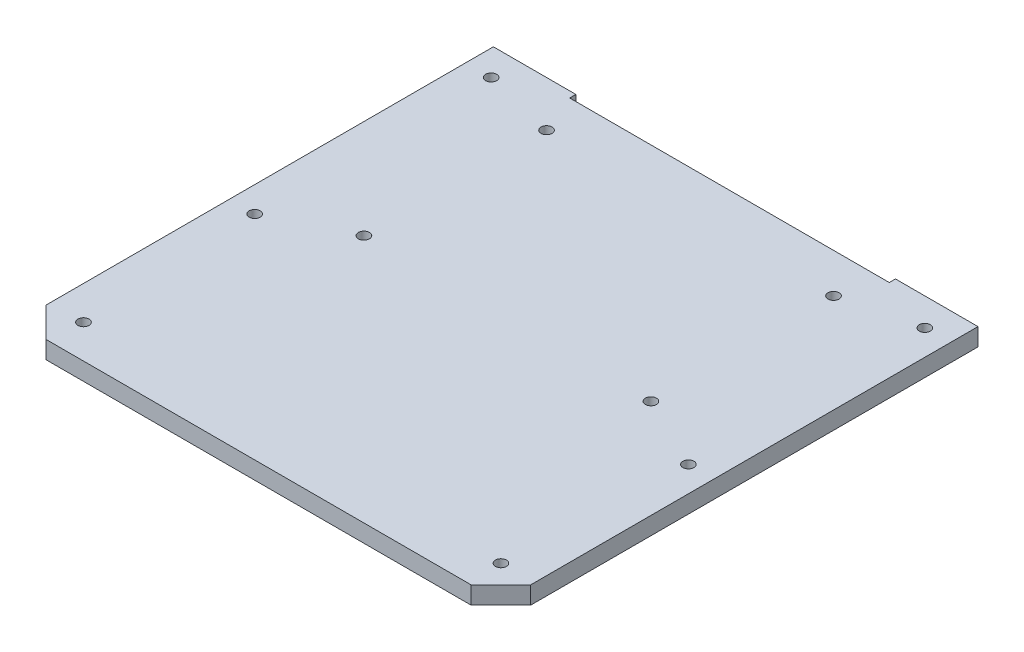
ISO-10303-21;
HEADER;
FILE_DESCRIPTION(('STEP AP214'),'2;1');
FILE_NAME('part.step','',(''),(''),'','','');
FILE_SCHEMA(('AUTOMOTIVE_DESIGN { 1 0 10303 214 1 1 1 1 }'));
ENDSEC;
DATA;
#1=APPLICATION_CONTEXT('core data for automotive mechanical design processes');
#2=APPLICATION_PROTOCOL_DEFINITION('international standard','automotive_design',2000,#1);
#3=PRODUCT_CONTEXT('',#1,'mechanical');
#4=PRODUCT('Part','Part','',(#3));
#5=PRODUCT_RELATED_PRODUCT_CATEGORY('part','',(#4));
#6=PRODUCT_DEFINITION_FORMATION('','',#4);
#7=PRODUCT_DEFINITION_CONTEXT('part definition',#1,'design');
#8=PRODUCT_DEFINITION('design','',#6,#7);
#9=PRODUCT_DEFINITION_SHAPE('','',#8);
#10=(LENGTH_UNIT() NAMED_UNIT(*) SI_UNIT(.MILLI.,.METRE.));
#11=(NAMED_UNIT(*) PLANE_ANGLE_UNIT() SI_UNIT($,.RADIAN.));
#12=(NAMED_UNIT(*) SI_UNIT($,.STERADIAN.) SOLID_ANGLE_UNIT());
#13=UNCERTAINTY_MEASURE_WITH_UNIT(LENGTH_MEASURE(1.E-05),#10,'distance_accuracy_value','');
#14=(GEOMETRIC_REPRESENTATION_CONTEXT(3) GLOBAL_UNCERTAINTY_ASSIGNED_CONTEXT((#13)) GLOBAL_UNIT_ASSIGNED_CONTEXT((#10,
#11,#12)) REPRESENTATION_CONTEXT('',''));
#15=CARTESIAN_POINT('',(0.,0.,0.));
#16=DIRECTION('',(0.,0.,1.));
#17=DIRECTION('',(1.,0.,0.));
#18=AXIS2_PLACEMENT_3D('',#15,#16,#17);
#19=CARTESIAN_POINT('',(0.,10.,0.));
#20=DIRECTION('',(0.,1.,0.));
#21=DIRECTION('',(0.,0.,1.));
#22=AXIS2_PLACEMENT_3D('',#19,#20,#21);
#23=PLANE('',#22);
#24=CARTESIAN_POINT('',(64.,10.,146.));
#25=DIRECTION('',(0.,1.,0.));
#26=DIRECTION('',(0.,0.,1.));
#27=AXIS2_PLACEMENT_3D('',#24,#25,#26);
#28=CIRCLE('',#27,1.69999999999999);
#29=CARTESIAN_POINT('',(64.,10.,147.7));
#30=VERTEX_POINT('',#29);
#31=EDGE_CURVE('E199',#30,#30,#28,.F.);
#32=ORIENTED_EDGE('',*,*,#31,.F.);
#33=EDGE_LOOP('',(#32));
#34=FACE_BOUND('',#33,.T.);
#35=CARTESIAN_POINT('',(-44.,10.,24.));
#36=DIRECTION('',(0.,1.,0.));
#37=DIRECTION('',(0.,0.,1.));
#38=AXIS2_PLACEMENT_3D('',#35,#36,#37);
#39=CIRCLE('',#38,1.7);
#40=CARTESIAN_POINT('',(-44.,10.,25.7));
#41=VERTEX_POINT('',#40);
#42=EDGE_CURVE('E369',#41,#41,#39,.F.);
#43=ORIENTED_EDGE('',*,*,#42,.F.);
#44=EDGE_LOOP('',(#43));
#45=FACE_BOUND('',#44,.T.);
#46=CARTESIAN_POINT('',(-44.,10.,80.));
#47=DIRECTION('',(0.,1.,0.));
#48=DIRECTION('',(0.,0.,1.));
#49=AXIS2_PLACEMENT_3D('',#46,#47,#48);
#50=CIRCLE('',#49,1.7);
#51=CARTESIAN_POINT('',(-44.,10.,81.7));
#52=VERTEX_POINT('',#51);
#53=EDGE_CURVE('E366',#52,#52,#50,.F.);
#54=ORIENTED_EDGE('',*,*,#53,.F.);
#55=EDGE_LOOP('',(#54));
#56=FACE_BOUND('',#55,.T.);
#57=CARTESIAN_POINT('',(44.,10.,24.));
#58=DIRECTION('',(0.,1.,0.));
#59=DIRECTION('',(0.,0.,1.));
#60=AXIS2_PLACEMENT_3D('',#57,#58,#59);
#61=CIRCLE('',#60,1.7);
#62=CARTESIAN_POINT('',(44.,10.,25.7));
#63=VERTEX_POINT('',#62);
#64=EDGE_CURVE('E363',#63,#63,#61,.F.);
#65=ORIENTED_EDGE('',*,*,#64,.F.);
#66=EDGE_LOOP('',(#65));
#67=FACE_BOUND('',#66,.T.);
#68=CARTESIAN_POINT('',(66.5,10.,18.5));
#69=DIRECTION('',(0.,1.,0.));
#70=DIRECTION('',(0.,0.,1.));
#71=AXIS2_PLACEMENT_3D('',#68,#69,#70);
#72=CIRCLE('',#71,1.69999999999999);
#73=CARTESIAN_POINT('',(66.5,10.,20.2));
#74=VERTEX_POINT('',#73);
#75=EDGE_CURVE('E359',#74,#74,#72,.F.);
#76=ORIENTED_EDGE('',*,*,#75,.F.);
#77=EDGE_LOOP('',(#76));
#78=FACE_BOUND('',#77,.T.);
#79=CARTESIAN_POINT('',(-66.5,10.,91.));
#80=DIRECTION('',(0.,1.,0.));
#81=DIRECTION('',(0.,0.,1.));
#82=AXIS2_PLACEMENT_3D('',#79,#80,#81);
#83=CIRCLE('',#82,1.69999999999999);
#84=CARTESIAN_POINT('',(-66.5,10.,92.7));
#85=VERTEX_POINT('',#84);
#86=EDGE_CURVE('E355',#85,#85,#83,.F.);
#87=ORIENTED_EDGE('',*,*,#86,.F.);
#88=EDGE_LOOP('',(#87));
#89=FACE_BOUND('',#88,.T.);
#90=CARTESIAN_POINT('',(66.5,10.,91.));
#91=DIRECTION('',(0.,1.,0.));
#92=DIRECTION('',(0.,0.,1.));
#93=AXIS2_PLACEMENT_3D('',#90,#91,#92);
#94=CIRCLE('',#93,1.69999999999999);
#95=CARTESIAN_POINT('',(66.5,10.,92.7));
#96=VERTEX_POINT('',#95);
#97=EDGE_CURVE('E351',#96,#96,#94,.F.);
#98=ORIENTED_EDGE('',*,*,#97,.F.);
#99=EDGE_LOOP('',(#98));
#100=FACE_BOUND('',#99,.T.);
#101=CARTESIAN_POINT('',(-64.,10.,146.));
#102=DIRECTION('',(0.,1.,0.));
#103=DIRECTION('',(0.,0.,1.));
#104=AXIS2_PLACEMENT_3D('',#101,#102,#103);
#105=CIRCLE('',#104,1.7);
#106=CARTESIAN_POINT('',(-64.,10.,147.7));
#107=VERTEX_POINT('',#106);
#108=EDGE_CURVE('E347',#107,#107,#105,.F.);
#109=ORIENTED_EDGE('',*,*,#108,.F.);
#110=EDGE_LOOP('',(#109));
#111=FACE_BOUND('',#110,.T.);
#112=CARTESIAN_POINT('',(44.,10.,80.));
#113=DIRECTION('',(0.,1.,0.));
#114=DIRECTION('',(0.,0.,1.));
#115=AXIS2_PLACEMENT_3D('',#112,#113,#114);
#116=CIRCLE('',#115,1.7);
#117=CARTESIAN_POINT('',(44.,10.,81.7));
#118=VERTEX_POINT('',#117);
#119=EDGE_CURVE('E343',#118,#118,#116,.F.);
#120=ORIENTED_EDGE('',*,*,#119,.F.);
#121=EDGE_LOOP('',(#120));
#122=FACE_BOUND('',#121,.T.);
#123=CARTESIAN_POINT('',(-66.5,10.,18.5));
#124=DIRECTION('',(0.,1.,0.));
#125=DIRECTION('',(0.,0.,1.));
#126=AXIS2_PLACEMENT_3D('',#123,#124,#125);
#127=CIRCLE('',#126,1.69999999999999);
#128=CARTESIAN_POINT('',(-66.5,10.,20.2));
#129=VERTEX_POINT('',#128);
#130=EDGE_CURVE('E339',#129,#129,#127,.F.);
#131=ORIENTED_EDGE('',*,*,#130,.F.);
#132=EDGE_LOOP('',(#131));
#133=FACE_BOUND('',#132,.T.);
#134=DIRECTION('',(0.,0.,-1.));
#135=VECTOR('',#134,1.);
#136=CARTESIAN_POINT('',(72.7,10.,0.));
#137=LINE('',#136,#135);
#138=CARTESIAN_POINT('',(72.7,10.,146.524264068712));
#139=VERTEX_POINT('',#138);
#140=CARTESIAN_POINT('',(72.7,10.,11.9));
#141=VERTEX_POINT('',#140);
#142=EDGE_CURVE('E329',#139,#141,#137,.T.);
#143=ORIENTED_EDGE('',*,*,#142,.F.);
#144=DIRECTION('',(0.707106781186546,0.,-0.707106781186549));
#145=VECTOR('',#144,1.);
#146=CARTESIAN_POINT('',(109.612132034356,10.,109.612132034356));
#147=LINE('',#146,#145);
#148=CARTESIAN_POINT('',(64.5242640687119,10.,154.7));
#149=VERTEX_POINT('',#148);
#150=EDGE_CURVE('E327',#149,#139,#147,.T.);
#151=ORIENTED_EDGE('',*,*,#150,.F.);
#152=DIRECTION('',(1.,0.,0.));
#153=VECTOR('',#152,1.);
#154=CARTESIAN_POINT('',(0.,10.,154.7));
#155=LINE('',#154,#153);
#156=CARTESIAN_POINT('',(-64.5242640687119,10.,154.7));
#157=VERTEX_POINT('',#156);
#158=EDGE_CURVE('E325',#157,#149,#155,.T.);
#159=ORIENTED_EDGE('',*,*,#158,.F.);
#160=DIRECTION('',(0.707106781186546,0.,0.707106781186549));
#161=VECTOR('',#160,1.);
#162=CARTESIAN_POINT('',(-109.612132034356,10.,109.612132034356));
#163=LINE('',#162,#161);
#164=CARTESIAN_POINT('',(-72.7,10.,146.524264068712));
#165=VERTEX_POINT('',#164);
#166=EDGE_CURVE('E323',#165,#157,#163,.T.);
#167=ORIENTED_EDGE('',*,*,#166,.F.);
#168=DIRECTION('',(0.,0.,1.));
#169=VECTOR('',#168,1.);
#170=CARTESIAN_POINT('',(-72.7,10.,0.));
#171=LINE('',#170,#169);
#172=CARTESIAN_POINT('',(-72.7,10.,11.9));
#173=VERTEX_POINT('',#172);
#174=EDGE_CURVE('E321',#173,#165,#171,.T.);
#175=ORIENTED_EDGE('',*,*,#174,.F.);
#176=DIRECTION('',(-1.,0.,0.));
#177=VECTOR('',#176,1.);
#178=CARTESIAN_POINT('',(74.3,10.,11.9));
#179=LINE('',#178,#177);
#180=CARTESIAN_POINT('',(-49.,10.,11.9));
#181=VERTEX_POINT('',#180);
#182=EDGE_CURVE('E295',#181,#173,#179,.T.);
#183=ORIENTED_EDGE('',*,*,#182,.F.);
#184=CARTESIAN_POINT('',(49.,10.,11.9));
#185=VERTEX_POINT('',#184);
#186=EDGE_CURVE('E313',#185,#181,#179,.T.);
#187=ORIENTED_EDGE('',*,*,#186,.F.);
#188=EDGE_CURVE('E300',#141,#185,#179,.T.);
#189=ORIENTED_EDGE('',*,*,#188,.F.);
#190=EDGE_LOOP('',(#143,#151,#159,#167,#175,#183,#187,#189));
#191=FACE_BOUND('',#190,.T.);
#192=DIRECTION('',(0.,0.,-1.));
#193=VECTOR('',#192,1.);
#194=CARTESIAN_POINT('',(-40.,10.,0.));
#195=LINE('',#194,#193);
#196=CARTESIAN_POINT('',(-40.,10.,140.));
#197=VERTEX_POINT('',#196);
#198=CARTESIAN_POINT('',(-40.,10.,106.));
#199=VERTEX_POINT('',#198);
#200=EDGE_CURVE('E11',#197,#199,#195,.T.);
#201=ORIENTED_EDGE('',*,*,#200,.F.);
#202=DIRECTION('',(-1.,0.,0.));
#203=VECTOR('',#202,1.);
#204=CARTESIAN_POINT('',(0.,10.,140.));
#205=LINE('',#204,#203);
#206=CARTESIAN_POINT('',(23.,10.,140.));
#207=VERTEX_POINT('',#206);
#208=EDGE_CURVE('E48',#207,#197,#205,.T.);
#209=ORIENTED_EDGE('',*,*,#208,.F.);
#210=DIRECTION('',(0.,0.,1.));
#211=VECTOR('',#210,1.);
#212=CARTESIAN_POINT('',(23.,10.,0.));
#213=LINE('',#212,#211);
#214=CARTESIAN_POINT('',(23.,10.,106.));
#215=VERTEX_POINT('',#214);
#216=EDGE_CURVE('E333',#215,#207,#213,.T.);
#217=ORIENTED_EDGE('',*,*,#216,.F.);
#218=DIRECTION('',(1.,0.,0.));
#219=VECTOR('',#218,1.);
#220=CARTESIAN_POINT('',(0.,10.,106.));
#221=LINE('',#220,#219);
#222=EDGE_CURVE('E331',#199,#215,#221,.T.);
#223=ORIENTED_EDGE('',*,*,#222,.F.);
#224=EDGE_LOOP('',(#201,#209,#217,#223));
#225=FACE_BOUND('',#224,.T.);
#226=ADVANCED_FACE('F39',(#34,#45,#56,#67,#78,#89,#100,#111,#122,#133,#191,#225),#23,.F.);
#227=CARTESIAN_POINT('',(74.3,12.4,11.9));
#228=DIRECTION('',(0.,0.,1.));
#229=DIRECTION('',(1.,0.,0.));
#230=AXIS2_PLACEMENT_3D('',#227,#228,#229);
#231=PLANE('',#230);
#232=DIRECTION('',(0.,-1.,0.));
#233=VECTOR('',#232,1.);
#234=CARTESIAN_POINT('',(49.,12.4,11.9));
#235=LINE('',#234,#233);
#236=CARTESIAN_POINT('',(49.,12.4,11.9));
#237=VERTEX_POINT('',#236);
#238=EDGE_CURVE('E63',#237,#185,#235,.T.);
#239=ORIENTED_EDGE('',*,*,#238,.T.);
#240=ORIENTED_EDGE('',*,*,#186,.T.);
#241=DIRECTION('',(0.,-1.,0.));
#242=VECTOR('',#241,1.);
#243=CARTESIAN_POINT('',(-49.,12.4,11.9));
#244=LINE('',#243,#242);
#245=CARTESIAN_POINT('',(-49.,12.4,11.9));
#246=VERTEX_POINT('',#245);
#247=EDGE_CURVE('E250',#246,#181,#244,.T.);
#248=ORIENTED_EDGE('',*,*,#247,.F.);
#249=DIRECTION('',(-1.,0.,0.));
#250=VECTOR('',#249,1.);
#251=CARTESIAN_POINT('',(74.3,12.4,11.9));
#252=LINE('',#251,#250);
#253=EDGE_CURVE('E306',#237,#246,#252,.T.);
#254=ORIENTED_EDGE('',*,*,#253,.F.);
#255=EDGE_LOOP('',(#239,#240,#248,#254));
#256=FACE_BOUND('',#255,.T.);
#257=ADVANCED_FACE('F404',(#256),#231,.F.);
#258=CARTESIAN_POINT('',(-74.3,12.4,147.187005768509));
#259=DIRECTION('',(0.707106781186548,0.,-0.707106781186548));
#260=DIRECTION('',(-0.707106781186548,0.,-0.707106781186548));
#261=AXIS2_PLACEMENT_3D('',#258,#259,#260);
#262=PLANE('',#261);
#263=DIRECTION('',(0.707106781186547,0.,0.707106781186547));
#264=VECTOR('',#263,1.);
#265=CARTESIAN_POINT('',(-65.1870057685089,7.,156.3));
#266=LINE('',#265,#264);
#267=CARTESIAN_POINT('',(-74.3,7.,147.187005768509));
#268=VERTEX_POINT('',#267);
#269=CARTESIAN_POINT('',(-65.1870057685089,7.,156.3));
#270=VERTEX_POINT('',#269);
#271=EDGE_CURVE('E270',#268,#270,#266,.T.);
#272=ORIENTED_EDGE('',*,*,#271,.T.);
#273=DIRECTION('',(0.,-1.,0.));
#274=VECTOR('',#273,1.);
#275=CARTESIAN_POINT('',(-65.1870057685089,12.4,156.3));
#276=LINE('',#275,#274);
#277=CARTESIAN_POINT('',(-65.1870057685089,12.4,156.3));
#278=VERTEX_POINT('',#277);
#279=EDGE_CURVE('E319',#278,#270,#276,.T.);
#280=ORIENTED_EDGE('',*,*,#279,.F.);
#281=DIRECTION('',(0.707106781186547,0.,0.707106781186547));
#282=VECTOR('',#281,1.);
#283=CARTESIAN_POINT('',(-74.3,12.4,147.187005768509));
#284=LINE('',#283,#282);
#285=CARTESIAN_POINT('',(-74.3,12.4,147.187005768509));
#286=VERTEX_POINT('',#285);
#287=EDGE_CURVE('E296',#286,#278,#284,.T.);
#288=ORIENTED_EDGE('',*,*,#287,.F.);
#289=DIRECTION('',(0.,-1.,0.));
#290=VECTOR('',#289,1.);
#291=CARTESIAN_POINT('',(-74.3,12.4,147.187005768509));
#292=LINE('',#291,#290);
#293=EDGE_CURVE('E310',#286,#268,#292,.T.);
#294=ORIENTED_EDGE('',*,*,#293,.T.);
#295=EDGE_LOOP('',(#272,#280,#288,#294));
#296=FACE_BOUND('',#295,.T.);
#297=ADVANCED_FACE('F41',(#296),#262,.F.);
#298=CARTESIAN_POINT('',(-65.1870057685089,12.4,156.3));
#299=DIRECTION('',(0.,0.,-1.));
#300=DIRECTION('',(-1.,0.,0.));
#301=AXIS2_PLACEMENT_3D('',#298,#299,#300);
#302=PLANE('',#301);
#303=DIRECTION('',(1.,0.,0.));
#304=VECTOR('',#303,1.);
#305=CARTESIAN_POINT('',(65.1870057685089,7.,156.3));
#306=LINE('',#305,#304);
#307=CARTESIAN_POINT('',(65.1870057685089,7.,156.3));
#308=VERTEX_POINT('',#307);
#309=EDGE_CURVE('E273',#270,#308,#306,.T.);
#310=ORIENTED_EDGE('',*,*,#309,.T.);
#311=DIRECTION('',(0.,-1.,0.));
#312=VECTOR('',#311,1.);
#313=CARTESIAN_POINT('',(65.1870057685089,12.4,156.3));
#314=LINE('',#313,#312);
#315=CARTESIAN_POINT('',(65.1870057685089,12.4,156.3));
#316=VERTEX_POINT('',#315);
#317=EDGE_CURVE('E317',#316,#308,#314,.T.);
#318=ORIENTED_EDGE('',*,*,#317,.F.);
#319=DIRECTION('',(1.,0.,0.));
#320=VECTOR('',#319,1.);
#321=CARTESIAN_POINT('',(-65.1870057685089,12.4,156.3));
#322=LINE('',#321,#320);
#323=EDGE_CURVE('E299',#278,#316,#322,.T.);
#324=ORIENTED_EDGE('',*,*,#323,.F.);
#325=ORIENTED_EDGE('',*,*,#279,.T.);
#326=EDGE_LOOP('',(#310,#318,#324,#325));
#327=FACE_BOUND('',#326,.T.);
#328=ADVANCED_FACE('F428',(#327),#302,.F.);
#329=CARTESIAN_POINT('',(65.1870057685089,12.4,156.3));
#330=DIRECTION('',(-0.707106781186548,0.,-0.707106781186548));
#331=DIRECTION('',(-0.707106781186548,0.,0.707106781186548));
#332=AXIS2_PLACEMENT_3D('',#329,#330,#331);
#333=PLANE('',#332);
#334=DIRECTION('',(0.707106781186547,0.,-0.707106781186547));
#335=VECTOR('',#334,1.);
#336=CARTESIAN_POINT('',(74.3,7.,147.187005768509));
#337=LINE('',#336,#335);
#338=CARTESIAN_POINT('',(74.3,7.,147.187005768509));
#339=VERTEX_POINT('',#338);
#340=EDGE_CURVE('E276',#308,#339,#337,.T.);
#341=ORIENTED_EDGE('',*,*,#340,.T.);
#342=DIRECTION('',(0.,-1.,0.));
#343=VECTOR('',#342,1.);
#344=CARTESIAN_POINT('',(74.3,12.4,147.187005768509));
#345=LINE('',#344,#343);
#346=CARTESIAN_POINT('',(74.3,12.4,147.187005768509));
#347=VERTEX_POINT('',#346);
#348=EDGE_CURVE('E315',#347,#339,#345,.T.);
#349=ORIENTED_EDGE('',*,*,#348,.F.);
#350=DIRECTION('',(0.707106781186547,0.,-0.707106781186547));
#351=VECTOR('',#350,1.);
#352=CARTESIAN_POINT('',(65.1870057685089,12.4,156.3));
#353=LINE('',#352,#351);
#354=EDGE_CURVE('E302',#316,#347,#353,.T.);
#355=ORIENTED_EDGE('',*,*,#354,.F.);
#356=ORIENTED_EDGE('',*,*,#317,.T.);
#357=EDGE_LOOP('',(#341,#349,#355,#356));
#358=FACE_BOUND('',#357,.T.);
#359=ADVANCED_FACE('F425',(#358),#333,.F.);
#360=CARTESIAN_POINT('',(74.3,12.4,147.187005768509));
#361=DIRECTION('',(-1.,0.,0.));
#362=DIRECTION('',(0.,0.,1.));
#363=AXIS2_PLACEMENT_3D('',#360,#361,#362);
#364=PLANE('',#363);
#365=DIRECTION('',(0.,0.,-1.));
#366=VECTOR('',#365,1.);
#367=CARTESIAN_POINT('',(74.3,7.,11.9));
#368=LINE('',#367,#366);
#369=CARTESIAN_POINT('',(74.3,7.,10.));
#370=VERTEX_POINT('',#369);
#371=EDGE_CURVE('E279',#339,#370,#368,.T.);
#372=ORIENTED_EDGE('',*,*,#371,.T.);
#373=DIRECTION('',(0.,-1.,0.));
#374=VECTOR('',#373,1.);
#375=CARTESIAN_POINT('',(74.3,12.4,10.));
#376=LINE('',#375,#374);
#377=CARTESIAN_POINT('',(74.3,12.4,10.));
#378=VERTEX_POINT('',#377);
#379=EDGE_CURVE('E225',#378,#370,#376,.T.);
#380=ORIENTED_EDGE('',*,*,#379,.F.);
#381=DIRECTION('',(0.,0.,-1.));
#382=VECTOR('',#381,1.);
#383=CARTESIAN_POINT('',(74.3,12.4,147.187005768509));
#384=LINE('',#383,#382);
#385=EDGE_CURVE('E304',#347,#378,#384,.T.);
#386=ORIENTED_EDGE('',*,*,#385,.F.);
#387=ORIENTED_EDGE('',*,*,#348,.T.);
#388=EDGE_LOOP('',(#372,#380,#386,#387));
#389=FACE_BOUND('',#388,.T.);
#390=ADVANCED_FACE('F420',(#389),#364,.F.);
#391=CARTESIAN_POINT('',(-74.3,12.4,11.9));
#392=DIRECTION('',(1.,0.,0.));
#393=DIRECTION('',(0.,0.,-1.));
#394=AXIS2_PLACEMENT_3D('',#391,#392,#393);
#395=PLANE('',#394);
#396=DIRECTION('',(0.,0.,1.));
#397=VECTOR('',#396,1.);
#398=CARTESIAN_POINT('',(-74.3,7.,147.187005768509));
#399=LINE('',#398,#397);
#400=CARTESIAN_POINT('',(-74.3,7.,10.));
#401=VERTEX_POINT('',#400);
#402=EDGE_CURVE('E267',#401,#268,#399,.T.);
#403=ORIENTED_EDGE('',*,*,#402,.T.);
#404=ORIENTED_EDGE('',*,*,#293,.F.);
#405=DIRECTION('',(0.,0.,1.));
#406=VECTOR('',#405,1.);
#407=CARTESIAN_POINT('',(-74.3,12.4,11.9));
#408=LINE('',#407,#406);
#409=CARTESIAN_POINT('',(-74.3,12.4,10.));
#410=VERTEX_POINT('',#409);
#411=EDGE_CURVE('E308',#410,#286,#408,.T.);
#412=ORIENTED_EDGE('',*,*,#411,.F.);
#413=DIRECTION('',(0.,-1.,0.));
#414=VECTOR('',#413,1.);
#415=CARTESIAN_POINT('',(-74.3,12.4,10.));
#416=LINE('',#415,#414);
#417=EDGE_CURVE('E237',#410,#401,#416,.T.);
#418=ORIENTED_EDGE('',*,*,#417,.T.);
#419=EDGE_LOOP('',(#403,#404,#412,#418));
#420=FACE_BOUND('',#419,.T.);
#421=ADVANCED_FACE('F418',(#420),#395,.F.);
#422=CARTESIAN_POINT('',(0.,12.4,0.));
#423=DIRECTION('',(0.,1.,0.));
#424=DIRECTION('',(0.,0.,1.));
#425=AXIS2_PLACEMENT_3D('',#422,#423,#424);
#426=PLANE('',#425);
#427=CARTESIAN_POINT('',(64.,12.4,146.));
#428=DIRECTION('',(0.,1.,0.));
#429=DIRECTION('',(0.,0.,1.));
#430=AXIS2_PLACEMENT_3D('',#427,#428,#429);
#431=CIRCLE('',#430,1.69999999999999);
#432=CARTESIAN_POINT('',(64.,12.4,147.7));
#433=VERTEX_POINT('',#432);
#434=EDGE_CURVE('E43',#433,#433,#431,.F.);
#435=ORIENTED_EDGE('',*,*,#434,.T.);
#436=EDGE_LOOP('',(#435));
#437=FACE_BOUND('',#436,.T.);
#438=CARTESIAN_POINT('',(-44.,12.4,24.));
#439=DIRECTION('',(0.,1.,0.));
#440=DIRECTION('',(0.,0.,1.));
#441=AXIS2_PLACEMENT_3D('',#438,#439,#440);
#442=CIRCLE('',#441,1.7);
#443=CARTESIAN_POINT('',(-44.,12.4,25.7));
#444=VERTEX_POINT('',#443);
#445=EDGE_CURVE('E367',#444,#444,#442,.F.);
#446=ORIENTED_EDGE('',*,*,#445,.T.);
#447=EDGE_LOOP('',(#446));
#448=FACE_BOUND('',#447,.T.);
#449=CARTESIAN_POINT('',(-44.,12.4,80.));
#450=DIRECTION('',(0.,1.,0.));
#451=DIRECTION('',(0.,0.,1.));
#452=AXIS2_PLACEMENT_3D('',#449,#450,#451);
#453=CIRCLE('',#452,1.7);
#454=CARTESIAN_POINT('',(-44.,12.4,81.7));
#455=VERTEX_POINT('',#454);
#456=EDGE_CURVE('E364',#455,#455,#453,.F.);
#457=ORIENTED_EDGE('',*,*,#456,.T.);
#458=EDGE_LOOP('',(#457));
#459=FACE_BOUND('',#458,.T.);
#460=CARTESIAN_POINT('',(44.,12.4,24.));
#461=DIRECTION('',(0.,1.,0.));
#462=DIRECTION('',(0.,0.,1.));
#463=AXIS2_PLACEMENT_3D('',#460,#461,#462);
#464=CIRCLE('',#463,1.7);
#465=CARTESIAN_POINT('',(44.,12.4,25.7));
#466=VERTEX_POINT('',#465);
#467=EDGE_CURVE('E360',#466,#466,#464,.F.);
#468=ORIENTED_EDGE('',*,*,#467,.T.);
#469=EDGE_LOOP('',(#468));
#470=FACE_BOUND('',#469,.T.);
#471=CARTESIAN_POINT('',(66.5,12.4,18.5));
#472=DIRECTION('',(0.,1.,0.));
#473=DIRECTION('',(0.,0.,1.));
#474=AXIS2_PLACEMENT_3D('',#471,#472,#473);
#475=CIRCLE('',#474,1.69999999999999);
#476=CARTESIAN_POINT('',(66.5,12.4,20.2));
#477=VERTEX_POINT('',#476);
#478=EDGE_CURVE('E356',#477,#477,#475,.F.);
#479=ORIENTED_EDGE('',*,*,#478,.T.);
#480=EDGE_LOOP('',(#479));
#481=FACE_BOUND('',#480,.T.);
#482=CARTESIAN_POINT('',(-66.5,12.4,91.));
#483=DIRECTION('',(0.,1.,0.));
#484=DIRECTION('',(0.,0.,1.));
#485=AXIS2_PLACEMENT_3D('',#482,#483,#484);
#486=CIRCLE('',#485,1.69999999999999);
#487=CARTESIAN_POINT('',(-66.5,12.4,92.7));
#488=VERTEX_POINT('',#487);
#489=EDGE_CURVE('E352',#488,#488,#486,.F.);
#490=ORIENTED_EDGE('',*,*,#489,.T.);
#491=EDGE_LOOP('',(#490));
#492=FACE_BOUND('',#491,.T.);
#493=CARTESIAN_POINT('',(66.5,12.4,91.));
#494=DIRECTION('',(0.,1.,0.));
#495=DIRECTION('',(0.,0.,1.));
#496=AXIS2_PLACEMENT_3D('',#493,#494,#495);
#497=CIRCLE('',#496,1.69999999999999);
#498=CARTESIAN_POINT('',(66.5,12.4,92.7));
#499=VERTEX_POINT('',#498);
#500=EDGE_CURVE('E348',#499,#499,#497,.F.);
#501=ORIENTED_EDGE('',*,*,#500,.T.);
#502=EDGE_LOOP('',(#501));
#503=FACE_BOUND('',#502,.T.);
#504=CARTESIAN_POINT('',(-64.,12.4,146.));
#505=DIRECTION('',(0.,1.,0.));
#506=DIRECTION('',(0.,0.,1.));
#507=AXIS2_PLACEMENT_3D('',#504,#505,#506);
#508=CIRCLE('',#507,1.7);
#509=CARTESIAN_POINT('',(-64.,12.4,147.7));
#510=VERTEX_POINT('',#509);
#511=EDGE_CURVE('E344',#510,#510,#508,.F.);
#512=ORIENTED_EDGE('',*,*,#511,.T.);
#513=EDGE_LOOP('',(#512));
#514=FACE_BOUND('',#513,.T.);
#515=CARTESIAN_POINT('',(44.,12.4,80.));
#516=DIRECTION('',(0.,1.,0.));
#517=DIRECTION('',(0.,0.,1.));
#518=AXIS2_PLACEMENT_3D('',#515,#516,#517);
#519=CIRCLE('',#518,1.7);
#520=CARTESIAN_POINT('',(44.,12.4,81.7));
#521=VERTEX_POINT('',#520);
#522=EDGE_CURVE('E340',#521,#521,#519,.F.);
#523=ORIENTED_EDGE('',*,*,#522,.T.);
#524=EDGE_LOOP('',(#523));
#525=FACE_BOUND('',#524,.T.);
#526=CARTESIAN_POINT('',(-66.5,12.4,18.5));
#527=DIRECTION('',(0.,1.,0.));
#528=DIRECTION('',(0.,0.,1.));
#529=AXIS2_PLACEMENT_3D('',#526,#527,#528);
#530=CIRCLE('',#529,1.69999999999999);
#531=CARTESIAN_POINT('',(-66.5,12.4,20.2));
#532=VERTEX_POINT('',#531);
#533=EDGE_CURVE('E336',#532,#532,#530,.F.);
#534=ORIENTED_EDGE('',*,*,#533,.T.);
#535=EDGE_LOOP('',(#534));
#536=FACE_BOUND('',#535,.T.);
#537=ORIENTED_EDGE('',*,*,#287,.T.);
#538=ORIENTED_EDGE('',*,*,#323,.T.);
#539=ORIENTED_EDGE('',*,*,#354,.T.);
#540=ORIENTED_EDGE('',*,*,#385,.T.);
#541=DIRECTION('',(-1.,0.,0.));
#542=VECTOR('',#541,1.);
#543=CARTESIAN_POINT('',(74.3,12.4,10.));
#544=LINE('',#543,#542);
#545=CARTESIAN_POINT('',(49.,12.4,10.));
#546=VERTEX_POINT('',#545);
#547=EDGE_CURVE('E216',#378,#546,#544,.T.);
#548=ORIENTED_EDGE('',*,*,#547,.T.);
#549=DIRECTION('',(0.,0.,1.));
#550=VECTOR('',#549,1.);
#551=CARTESIAN_POINT('',(49.,12.4,10.));
#552=LINE('',#551,#550);
#553=EDGE_CURVE('E213',#546,#237,#552,.T.);
#554=ORIENTED_EDGE('',*,*,#553,.T.);
#555=ORIENTED_EDGE('',*,*,#253,.T.);
#556=DIRECTION('',(0.,0.,-1.));
#557=VECTOR('',#556,1.);
#558=CARTESIAN_POINT('',(-49.,12.4,11.9));
#559=LINE('',#558,#557);
#560=CARTESIAN_POINT('',(-49.,12.4,10.));
#561=VERTEX_POINT('',#560);
#562=EDGE_CURVE('E231',#246,#561,#559,.T.);
#563=ORIENTED_EDGE('',*,*,#562,.T.);
#564=DIRECTION('',(-1.,0.,0.));
#565=VECTOR('',#564,1.);
#566=CARTESIAN_POINT('',(-49.,12.4,10.));
#567=LINE('',#566,#565);
#568=EDGE_CURVE('E233',#561,#410,#567,.T.);
#569=ORIENTED_EDGE('',*,*,#568,.T.);
#570=ORIENTED_EDGE('',*,*,#411,.T.);
#571=EDGE_LOOP('',(#537,#538,#539,#540,#548,#554,#555,#563,#569,#570));
#572=FACE_BOUND('',#571,.T.);
#573=ADVANCED_FACE('F416',(#437,#448,#459,#470,#481,#492,#503,#514,#525,#536,#572),#426,.T.);
#574=CARTESIAN_POINT('',(72.7,10.01,146.524264068712));
#575=DIRECTION('',(1.,0.,0.));
#576=DIRECTION('',(0.,0.,-1.));
#577=AXIS2_PLACEMENT_3D('',#574,#575,#576);
#578=PLANE('',#577);
#579=DIRECTION('',(0.,-1.,0.));
#580=VECTOR('',#579,1.);
#581=CARTESIAN_POINT('',(72.7,10.01,146.524264068712));
#582=LINE('',#581,#580);
#583=CARTESIAN_POINT('',(72.7,7.,146.524264068712));
#584=VERTEX_POINT('',#583);
#585=EDGE_CURVE('E290',#139,#584,#582,.T.);
#586=ORIENTED_EDGE('',*,*,#585,.F.);
#587=ORIENTED_EDGE('',*,*,#142,.T.);
#588=DIRECTION('',(0.,-1.,0.));
#589=VECTOR('',#588,1.);
#590=CARTESIAN_POINT('',(72.7,10.01,11.9));
#591=LINE('',#590,#589);
#592=CARTESIAN_POINT('',(72.7,7.,11.9));
#593=VERTEX_POINT('',#592);
#594=EDGE_CURVE('E292',#141,#593,#591,.T.);
#595=ORIENTED_EDGE('',*,*,#594,.T.);
#596=DIRECTION('',(0.,0.,1.));
#597=VECTOR('',#596,1.);
#598=CARTESIAN_POINT('',(72.7,7.,146.524264068712));
#599=LINE('',#598,#597);
#600=EDGE_CURVE('E253',#593,#584,#599,.T.);
#601=ORIENTED_EDGE('',*,*,#600,.T.);
#602=EDGE_LOOP('',(#586,#587,#595,#601));
#603=FACE_BOUND('',#602,.T.);
#604=ADVANCED_FACE('F493',(#603),#578,.F.);
#605=CARTESIAN_POINT('',(64.5242640687119,10.01,154.7));
#606=DIRECTION('',(0.707106781186549,0.,0.707106781186546));
#607=DIRECTION('',(0.707106781186546,0.,-0.707106781186549));
#608=AXIS2_PLACEMENT_3D('',#605,#606,#607);
#609=PLANE('',#608);
#610=DIRECTION('',(0.,-1.,0.));
#611=VECTOR('',#610,1.);
#612=CARTESIAN_POINT('',(64.5242640687119,10.01,154.7));
#613=LINE('',#612,#611);
#614=CARTESIAN_POINT('',(64.5242640687119,7.,154.7));
#615=VERTEX_POINT('',#614);
#616=EDGE_CURVE('E288',#149,#615,#613,.T.);
#617=ORIENTED_EDGE('',*,*,#616,.F.);
#618=ORIENTED_EDGE('',*,*,#150,.T.);
#619=ORIENTED_EDGE('',*,*,#585,.T.);
#620=DIRECTION('',(-0.707106781186546,0.,0.707106781186549));
#621=VECTOR('',#620,1.);
#622=CARTESIAN_POINT('',(64.5242640687119,7.,154.7));
#623=LINE('',#622,#621);
#624=EDGE_CURVE('E256',#584,#615,#623,.T.);
#625=ORIENTED_EDGE('',*,*,#624,.T.);
#626=EDGE_LOOP('',(#617,#618,#619,#625));
#627=FACE_BOUND('',#626,.T.);
#628=ADVANCED_FACE('F490',(#627),#609,.F.);
#629=CARTESIAN_POINT('',(-64.5242640687119,10.01,154.7));
#630=DIRECTION('',(0.,0.,1.));
#631=DIRECTION('',(1.,0.,0.));
#632=AXIS2_PLACEMENT_3D('',#629,#630,#631);
#633=PLANE('',#632);
#634=DIRECTION('',(0.,-1.,0.));
#635=VECTOR('',#634,1.);
#636=CARTESIAN_POINT('',(-64.5242640687119,10.01,154.7));
#637=LINE('',#636,#635);
#638=CARTESIAN_POINT('',(-64.5242640687119,7.,154.7));
#639=VERTEX_POINT('',#638);
#640=EDGE_CURVE('E286',#157,#639,#637,.T.);
#641=ORIENTED_EDGE('',*,*,#640,.F.);
#642=ORIENTED_EDGE('',*,*,#158,.T.);
#643=ORIENTED_EDGE('',*,*,#616,.T.);
#644=DIRECTION('',(-1.,0.,0.));
#645=VECTOR('',#644,1.);
#646=CARTESIAN_POINT('',(-64.5242640687119,7.,154.7));
#647=LINE('',#646,#645);
#648=EDGE_CURVE('E259',#615,#639,#647,.T.);
#649=ORIENTED_EDGE('',*,*,#648,.T.);
#650=EDGE_LOOP('',(#641,#642,#643,#649));
#651=FACE_BOUND('',#650,.T.);
#652=ADVANCED_FACE('F484',(#651),#633,.F.);
#653=CARTESIAN_POINT('',(-72.7,10.01,146.524264068712));
#654=DIRECTION('',(-0.707106781186549,0.,0.707106781186546));
#655=DIRECTION('',(0.707106781186546,0.,0.707106781186549));
#656=AXIS2_PLACEMENT_3D('',#653,#654,#655);
#657=PLANE('',#656);
#658=DIRECTION('',(0.,-1.,0.));
#659=VECTOR('',#658,1.);
#660=CARTESIAN_POINT('',(-72.7,10.01,146.524264068712));
#661=LINE('',#660,#659);
#662=CARTESIAN_POINT('',(-72.7,7.,146.524264068712));
#663=VERTEX_POINT('',#662);
#664=EDGE_CURVE('E284',#165,#663,#661,.T.);
#665=ORIENTED_EDGE('',*,*,#664,.F.);
#666=ORIENTED_EDGE('',*,*,#166,.T.);
#667=ORIENTED_EDGE('',*,*,#640,.T.);
#668=DIRECTION('',(-0.707106781186546,0.,-0.707106781186549));
#669=VECTOR('',#668,1.);
#670=CARTESIAN_POINT('',(-72.7,7.,146.524264068712));
#671=LINE('',#670,#669);
#672=EDGE_CURVE('E262',#639,#663,#671,.T.);
#673=ORIENTED_EDGE('',*,*,#672,.T.);
#674=EDGE_LOOP('',(#665,#666,#667,#673));
#675=FACE_BOUND('',#674,.T.);
#676=ADVANCED_FACE('F482',(#675),#657,.F.);
#677=CARTESIAN_POINT('',(-72.7,10.01,11.9));
#678=DIRECTION('',(-1.,0.,0.));
#679=DIRECTION('',(0.,0.,1.));
#680=AXIS2_PLACEMENT_3D('',#677,#678,#679);
#681=PLANE('',#680);
#682=DIRECTION('',(0.,-1.,0.));
#683=VECTOR('',#682,1.);
#684=CARTESIAN_POINT('',(-72.7,10.01,11.9));
#685=LINE('',#684,#683);
#686=CARTESIAN_POINT('',(-72.7,7.,11.9));
#687=VERTEX_POINT('',#686);
#688=EDGE_CURVE('E281',#173,#687,#685,.T.);
#689=ORIENTED_EDGE('',*,*,#688,.F.);
#690=ORIENTED_EDGE('',*,*,#174,.T.);
#691=ORIENTED_EDGE('',*,*,#664,.T.);
#692=DIRECTION('',(0.,0.,-1.));
#693=VECTOR('',#692,1.);
#694=CARTESIAN_POINT('',(-72.7,7.,11.9));
#695=LINE('',#694,#693);
#696=EDGE_CURVE('E265',#663,#687,#695,.T.);
#697=ORIENTED_EDGE('',*,*,#696,.T.);
#698=EDGE_LOOP('',(#689,#690,#691,#697));
#699=FACE_BOUND('',#698,.T.);
#700=ADVANCED_FACE('F473',(#699),#681,.F.);
#701=CARTESIAN_POINT('',(0.,7.,0.));
#702=DIRECTION('',(0.,-1.,0.));
#703=DIRECTION('',(0.,0.,-1.));
#704=AXIS2_PLACEMENT_3D('',#701,#702,#703);
#705=PLANE('',#704);
#706=ORIENTED_EDGE('',*,*,#600,.F.);
#707=DIRECTION('',(1.,0.,0.));
#708=VECTOR('',#707,1.);
#709=CARTESIAN_POINT('',(49.,7.,11.9));
#710=LINE('',#709,#708);
#711=CARTESIAN_POINT('',(49.,7.,11.9));
#712=VERTEX_POINT('',#711);
#713=EDGE_CURVE('E207',#712,#593,#710,.T.);
#714=ORIENTED_EDGE('',*,*,#713,.F.);
#715=DIRECTION('',(0.,0.,1.));
#716=VECTOR('',#715,1.);
#717=CARTESIAN_POINT('',(49.,7.,10.));
#718=LINE('',#717,#716);
#719=CARTESIAN_POINT('',(49.,7.,10.));
#720=VERTEX_POINT('',#719);
#721=EDGE_CURVE('E203',#720,#712,#718,.T.);
#722=ORIENTED_EDGE('',*,*,#721,.F.);
#723=DIRECTION('',(-1.,0.,0.));
#724=VECTOR('',#723,1.);
#725=CARTESIAN_POINT('',(74.3,7.,10.));
#726=LINE('',#725,#724);
#727=EDGE_CURVE('E217',#370,#720,#726,.T.);
#728=ORIENTED_EDGE('',*,*,#727,.F.);
#729=ORIENTED_EDGE('',*,*,#371,.F.);
#730=ORIENTED_EDGE('',*,*,#340,.F.);
#731=ORIENTED_EDGE('',*,*,#309,.F.);
#732=ORIENTED_EDGE('',*,*,#271,.F.);
#733=ORIENTED_EDGE('',*,*,#402,.F.);
#734=DIRECTION('',(-1.,0.,0.));
#735=VECTOR('',#734,1.);
#736=CARTESIAN_POINT('',(-49.,7.,10.));
#737=LINE('',#736,#735);
#738=CARTESIAN_POINT('',(-49.,7.,10.));
#739=VERTEX_POINT('',#738);
#740=EDGE_CURVE('E234',#739,#401,#737,.T.);
#741=ORIENTED_EDGE('',*,*,#740,.F.);
#742=DIRECTION('',(0.,0.,-1.));
#743=VECTOR('',#742,1.);
#744=CARTESIAN_POINT('',(-49.,7.,11.9));
#745=LINE('',#744,#743);
#746=CARTESIAN_POINT('',(-49.,7.,11.9));
#747=VERTEX_POINT('',#746);
#748=EDGE_CURVE('E240',#747,#739,#745,.T.);
#749=ORIENTED_EDGE('',*,*,#748,.F.);
#750=DIRECTION('',(1.,0.,0.));
#751=VECTOR('',#750,1.);
#752=CARTESIAN_POINT('',(-74.3,7.,11.9));
#753=LINE('',#752,#751);
#754=EDGE_CURVE('E230',#687,#747,#753,.T.);
#755=ORIENTED_EDGE('',*,*,#754,.F.);
#756=ORIENTED_EDGE('',*,*,#696,.F.);
#757=ORIENTED_EDGE('',*,*,#672,.F.);
#758=ORIENTED_EDGE('',*,*,#648,.F.);
#759=ORIENTED_EDGE('',*,*,#624,.F.);
#760=EDGE_LOOP('',(#706,#714,#722,#728,#729,#730,#731,#732,#733,#741,#749,#755,#756,#757,#758,#759));
#761=FACE_BOUND('',#760,.T.);
#762=ADVANCED_FACE('F444',(#761),#705,.T.);
#763=CARTESIAN_POINT('',(-74.3,12.4,11.9));
#764=DIRECTION('',(0.,0.,-1.));
#765=DIRECTION('',(-1.,0.,0.));
#766=AXIS2_PLACEMENT_3D('',#763,#764,#765);
#767=PLANE('',#766);
#768=EDGE_CURVE('E249',#181,#747,#244,.T.);
#769=ORIENTED_EDGE('',*,*,#768,.F.);
#770=ORIENTED_EDGE('',*,*,#182,.T.);
#771=ORIENTED_EDGE('',*,*,#688,.T.);
#772=ORIENTED_EDGE('',*,*,#754,.T.);
#773=EDGE_LOOP('',(#769,#770,#771,#772));
#774=FACE_BOUND('',#773,.T.);
#775=ADVANCED_FACE('F468',(#774),#767,.F.);
#776=CARTESIAN_POINT('',(-49.,12.4,11.9));
#777=DIRECTION('',(-1.,0.,0.));
#778=DIRECTION('',(0.,0.,1.));
#779=AXIS2_PLACEMENT_3D('',#776,#777,#778);
#780=PLANE('',#779);
#781=ORIENTED_EDGE('',*,*,#748,.T.);
#782=DIRECTION('',(0.,-1.,0.));
#783=VECTOR('',#782,1.);
#784=CARTESIAN_POINT('',(-49.,12.4,10.));
#785=LINE('',#784,#783);
#786=EDGE_CURVE('E246',#561,#739,#785,.T.);
#787=ORIENTED_EDGE('',*,*,#786,.F.);
#788=ORIENTED_EDGE('',*,*,#562,.F.);
#789=ORIENTED_EDGE('',*,*,#247,.T.);
#790=ORIENTED_EDGE('',*,*,#768,.T.);
#791=EDGE_LOOP('',(#781,#787,#788,#789,#790));
#792=FACE_BOUND('',#791,.T.);
#793=ADVANCED_FACE('F462',(#792),#780,.F.);
#794=CARTESIAN_POINT('',(-49.,12.4,10.));
#795=DIRECTION('',(0.,0.,1.));
#796=DIRECTION('',(1.,0.,0.));
#797=AXIS2_PLACEMENT_3D('',#794,#795,#796);
#798=PLANE('',#797);
#799=ORIENTED_EDGE('',*,*,#740,.T.);
#800=ORIENTED_EDGE('',*,*,#417,.F.);
#801=ORIENTED_EDGE('',*,*,#568,.F.);
#802=ORIENTED_EDGE('',*,*,#786,.T.);
#803=EDGE_LOOP('',(#799,#800,#801,#802));
#804=FACE_BOUND('',#803,.T.);
#805=ADVANCED_FACE('F456',(#804),#798,.F.);
#806=CARTESIAN_POINT('',(49.,12.4,11.9));
#807=DIRECTION('',(0.,0.,-1.));
#808=DIRECTION('',(-1.,0.,0.));
#809=AXIS2_PLACEMENT_3D('',#806,#807,#808);
#810=PLANE('',#809);
#811=ORIENTED_EDGE('',*,*,#594,.F.);
#812=ORIENTED_EDGE('',*,*,#188,.T.);
#813=EDGE_CURVE('E228',#185,#712,#235,.T.);
#814=ORIENTED_EDGE('',*,*,#813,.T.);
#815=ORIENTED_EDGE('',*,*,#713,.T.);
#816=EDGE_LOOP('',(#811,#812,#814,#815));
#817=FACE_BOUND('',#816,.T.);
#818=ADVANCED_FACE('F497',(#817),#810,.F.);
#819=CARTESIAN_POINT('',(49.,12.4,10.));
#820=DIRECTION('',(1.,0.,0.));
#821=DIRECTION('',(0.,0.,-1.));
#822=AXIS2_PLACEMENT_3D('',#819,#820,#821);
#823=PLANE('',#822);
#824=ORIENTED_EDGE('',*,*,#721,.T.);
#825=ORIENTED_EDGE('',*,*,#813,.F.);
#826=ORIENTED_EDGE('',*,*,#238,.F.);
#827=ORIENTED_EDGE('',*,*,#553,.F.);
#828=DIRECTION('',(0.,-1.,0.));
#829=VECTOR('',#828,1.);
#830=CARTESIAN_POINT('',(49.,12.4,10.));
#831=LINE('',#830,#829);
#832=EDGE_CURVE('E218',#546,#720,#831,.T.);
#833=ORIENTED_EDGE('',*,*,#832,.T.);
#834=EDGE_LOOP('',(#824,#825,#826,#827,#833));
#835=FACE_BOUND('',#834,.T.);
#836=ADVANCED_FACE('F501',(#835),#823,.F.);
#837=CARTESIAN_POINT('',(74.3,12.4,10.));
#838=DIRECTION('',(0.,0.,1.));
#839=DIRECTION('',(1.,0.,0.));
#840=AXIS2_PLACEMENT_3D('',#837,#838,#839);
#841=PLANE('',#840);
#842=ORIENTED_EDGE('',*,*,#727,.T.);
#843=ORIENTED_EDGE('',*,*,#832,.F.);
#844=ORIENTED_EDGE('',*,*,#547,.F.);
#845=ORIENTED_EDGE('',*,*,#379,.T.);
#846=EDGE_LOOP('',(#842,#843,#844,#845));
#847=FACE_BOUND('',#846,.T.);
#848=ADVANCED_FACE('F506',(#847),#841,.F.);
#849=CARTESIAN_POINT('',(-40.,11.2,106.));
#850=DIRECTION('',(1.,0.,0.));
#851=DIRECTION('',(0.,0.,-1.));
#852=AXIS2_PLACEMENT_3D('',#849,#850,#851);
#853=PLANE('',#852);
#854=ORIENTED_EDGE('',*,*,#200,.T.);
#855=DIRECTION('',(0.,-1.,0.));
#856=VECTOR('',#855,1.);
#857=CARTESIAN_POINT('',(-40.,11.2,106.));
#858=LINE('',#857,#856);
#859=CARTESIAN_POINT('',(-40.,11.2,106.));
#860=VERTEX_POINT('',#859);
#861=EDGE_CURVE('E56',#860,#199,#858,.T.);
#862=ORIENTED_EDGE('',*,*,#861,.F.);
#863=DIRECTION('',(0.,0.,1.));
#864=VECTOR('',#863,1.);
#865=CARTESIAN_POINT('',(-40.,11.2,106.));
#866=LINE('',#865,#864);
#867=CARTESIAN_POINT('',(-40.,11.2,140.));
#868=VERTEX_POINT('',#867);
#869=EDGE_CURVE('E187',#860,#868,#866,.T.);
#870=ORIENTED_EDGE('',*,*,#869,.T.);
#871=DIRECTION('',(0.,-1.,0.));
#872=VECTOR('',#871,1.);
#873=CARTESIAN_POINT('',(-40.,11.2,140.));
#874=LINE('',#873,#872);
#875=EDGE_CURVE('E197',#868,#197,#874,.T.);
#876=ORIENTED_EDGE('',*,*,#875,.T.);
#877=EDGE_LOOP('',(#854,#862,#870,#876));
#878=FACE_BOUND('',#877,.T.);
#879=ADVANCED_FACE('F196',(#878),#853,.T.);
#880=CARTESIAN_POINT('',(-40.,11.2,140.));
#881=DIRECTION('',(0.,0.,-1.));
#882=DIRECTION('',(-1.,0.,0.));
#883=AXIS2_PLACEMENT_3D('',#880,#881,#882);
#884=PLANE('',#883);
#885=ORIENTED_EDGE('',*,*,#208,.T.);
#886=ORIENTED_EDGE('',*,*,#875,.F.);
#887=DIRECTION('',(1.,0.,0.));
#888=VECTOR('',#887,1.);
#889=CARTESIAN_POINT('',(-40.,11.2,140.));
#890=LINE('',#889,#888);
#891=CARTESIAN_POINT('',(23.,11.2,140.));
#892=VERTEX_POINT('',#891);
#893=EDGE_CURVE('E183',#868,#892,#890,.T.);
#894=ORIENTED_EDGE('',*,*,#893,.T.);
#895=DIRECTION('',(0.,-1.,0.));
#896=VECTOR('',#895,1.);
#897=CARTESIAN_POINT('',(23.,11.2,140.));
#898=LINE('',#897,#896);
#899=EDGE_CURVE('E204',#892,#207,#898,.T.);
#900=ORIENTED_EDGE('',*,*,#899,.T.);
#901=EDGE_LOOP('',(#885,#886,#894,#900));
#902=FACE_BOUND('',#901,.T.);
#903=ADVANCED_FACE('F201',(#902),#884,.T.);
#904=CARTESIAN_POINT('',(23.,11.2,140.));
#905=DIRECTION('',(-1.,0.,0.));
#906=DIRECTION('',(0.,0.,1.));
#907=AXIS2_PLACEMENT_3D('',#904,#905,#906);
#908=PLANE('',#907);
#909=ORIENTED_EDGE('',*,*,#216,.T.);
#910=ORIENTED_EDGE('',*,*,#899,.F.);
#911=DIRECTION('',(0.,0.,-1.));
#912=VECTOR('',#911,1.);
#913=CARTESIAN_POINT('',(23.,11.2,140.));
#914=LINE('',#913,#912);
#915=CARTESIAN_POINT('',(23.,11.2,106.));
#916=VERTEX_POINT('',#915);
#917=EDGE_CURVE('E188',#892,#916,#914,.T.);
#918=ORIENTED_EDGE('',*,*,#917,.T.);
#919=DIRECTION('',(0.,-1.,0.));
#920=VECTOR('',#919,1.);
#921=CARTESIAN_POINT('',(23.,11.2,106.));
#922=LINE('',#921,#920);
#923=EDGE_CURVE('E209',#916,#215,#922,.T.);
#924=ORIENTED_EDGE('',*,*,#923,.T.);
#925=EDGE_LOOP('',(#909,#910,#918,#924));
#926=FACE_BOUND('',#925,.T.);
#927=ADVANCED_FACE('F390',(#926),#908,.T.);
#928=CARTESIAN_POINT('',(23.,11.2,106.));
#929=DIRECTION('',(0.,0.,1.));
#930=DIRECTION('',(1.,0.,0.));
#931=AXIS2_PLACEMENT_3D('',#928,#929,#930);
#932=PLANE('',#931);
#933=ORIENTED_EDGE('',*,*,#222,.T.);
#934=ORIENTED_EDGE('',*,*,#923,.F.);
#935=DIRECTION('',(-1.,0.,0.));
#936=VECTOR('',#935,1.);
#937=CARTESIAN_POINT('',(23.,11.2,106.));
#938=LINE('',#937,#936);
#939=EDGE_CURVE('E384',#916,#860,#938,.T.);
#940=ORIENTED_EDGE('',*,*,#939,.T.);
#941=ORIENTED_EDGE('',*,*,#861,.T.);
#942=EDGE_LOOP('',(#933,#934,#940,#941));
#943=FACE_BOUND('',#942,.T.);
#944=ADVANCED_FACE('F393',(#943),#932,.T.);
#945=CARTESIAN_POINT('',(0.,11.2,0.));
#946=DIRECTION('',(0.,1.,0.));
#947=DIRECTION('',(0.,0.,1.));
#948=AXIS2_PLACEMENT_3D('',#945,#946,#947);
#949=PLANE('',#948);
#950=ORIENTED_EDGE('',*,*,#869,.F.);
#951=ORIENTED_EDGE('',*,*,#939,.F.);
#952=ORIENTED_EDGE('',*,*,#917,.F.);
#953=ORIENTED_EDGE('',*,*,#893,.F.);
#954=EDGE_LOOP('',(#950,#951,#952,#953));
#955=FACE_BOUND('',#954,.T.);
#956=ADVANCED_FACE('F185',(#955),#949,.F.);
#957=CARTESIAN_POINT('',(-66.5,13.4,18.5));
#958=DIRECTION('',(0.,-1.,0.));
#959=DIRECTION('',(0.,0.,-1.));
#960=AXIS2_PLACEMENT_3D('',#957,#958,#959);
#961=CYLINDRICAL_SURFACE('',#960,1.69999999999999);
#962=ORIENTED_EDGE('',*,*,#533,.F.);
#963=EDGE_LOOP('',(#962));
#964=FACE_BOUND('',#963,.T.);
#965=ORIENTED_EDGE('',*,*,#130,.T.);
#966=EDGE_LOOP('',(#965));
#967=FACE_BOUND('',#966,.T.);
#968=ADVANCED_FACE('F400',(#964,#967),#961,.F.);
#969=CARTESIAN_POINT('',(44.,13.4,80.));
#970=DIRECTION('',(0.,-1.,0.));
#971=DIRECTION('',(0.,0.,-1.));
#972=AXIS2_PLACEMENT_3D('',#969,#970,#971);
#973=CYLINDRICAL_SURFACE('',#972,1.7);
#974=ORIENTED_EDGE('',*,*,#522,.F.);
#975=EDGE_LOOP('',(#974));
#976=FACE_BOUND('',#975,.T.);
#977=ORIENTED_EDGE('',*,*,#119,.T.);
#978=EDGE_LOOP('',(#977));
#979=FACE_BOUND('',#978,.T.);
#980=ADVANCED_FACE('F561',(#976,#979),#973,.F.);
#981=CARTESIAN_POINT('',(-64.,13.4,146.));
#982=DIRECTION('',(0.,-1.,0.));
#983=DIRECTION('',(0.,0.,-1.));
#984=AXIS2_PLACEMENT_3D('',#981,#982,#983);
#985=CYLINDRICAL_SURFACE('',#984,1.7);
#986=ORIENTED_EDGE('',*,*,#511,.F.);
#987=EDGE_LOOP('',(#986));
#988=FACE_BOUND('',#987,.T.);
#989=ORIENTED_EDGE('',*,*,#108,.T.);
#990=EDGE_LOOP('',(#989));
#991=FACE_BOUND('',#990,.T.);
#992=ADVANCED_FACE('F590',(#988,#991),#985,.F.);
#993=CARTESIAN_POINT('',(66.5,13.4,91.));
#994=DIRECTION('',(0.,-1.,0.));
#995=DIRECTION('',(0.,0.,-1.));
#996=AXIS2_PLACEMENT_3D('',#993,#994,#995);
#997=CYLINDRICAL_SURFACE('',#996,1.69999999999999);
#998=ORIENTED_EDGE('',*,*,#500,.F.);
#999=EDGE_LOOP('',(#998));
#1000=FACE_BOUND('',#999,.T.);
#1001=ORIENTED_EDGE('',*,*,#97,.T.);
#1002=EDGE_LOOP('',(#1001));
#1003=FACE_BOUND('',#1002,.T.);
#1004=ADVANCED_FACE('F596',(#1000,#1003),#997,.F.);
#1005=CARTESIAN_POINT('',(-66.5,13.4,91.));
#1006=DIRECTION('',(0.,-1.,0.));
#1007=DIRECTION('',(0.,0.,-1.));
#1008=AXIS2_PLACEMENT_3D('',#1005,#1006,#1007);
#1009=CYLINDRICAL_SURFACE('',#1008,1.69999999999999);
#1010=ORIENTED_EDGE('',*,*,#489,.F.);
#1011=EDGE_LOOP('',(#1010));
#1012=FACE_BOUND('',#1011,.T.);
#1013=ORIENTED_EDGE('',*,*,#86,.T.);
#1014=EDGE_LOOP('',(#1013));
#1015=FACE_BOUND('',#1014,.T.);
#1016=ADVANCED_FACE('F617',(#1012,#1015),#1009,.F.);
#1017=CARTESIAN_POINT('',(66.5,13.4,18.5));
#1018=DIRECTION('',(0.,-1.,0.));
#1019=DIRECTION('',(0.,0.,-1.));
#1020=AXIS2_PLACEMENT_3D('',#1017,#1018,#1019);
#1021=CYLINDRICAL_SURFACE('',#1020,1.69999999999999);
#1022=ORIENTED_EDGE('',*,*,#478,.F.);
#1023=EDGE_LOOP('',(#1022));
#1024=FACE_BOUND('',#1023,.T.);
#1025=ORIENTED_EDGE('',*,*,#75,.T.);
#1026=EDGE_LOOP('',(#1025));
#1027=FACE_BOUND('',#1026,.T.);
#1028=ADVANCED_FACE('F578',(#1024,#1027),#1021,.F.);
#1029=CARTESIAN_POINT('',(44.,13.4,24.));
#1030=DIRECTION('',(0.,-1.,0.));
#1031=DIRECTION('',(0.,0.,-1.));
#1032=AXIS2_PLACEMENT_3D('',#1029,#1030,#1031);
#1033=CYLINDRICAL_SURFACE('',#1032,1.7);
#1034=ORIENTED_EDGE('',*,*,#467,.F.);
#1035=EDGE_LOOP('',(#1034));
#1036=FACE_BOUND('',#1035,.T.);
#1037=ORIENTED_EDGE('',*,*,#64,.T.);
#1038=EDGE_LOOP('',(#1037));
#1039=FACE_BOUND('',#1038,.T.);
#1040=ADVANCED_FACE('F604',(#1036,#1039),#1033,.F.);
#1041=CARTESIAN_POINT('',(-44.,13.4,80.));
#1042=DIRECTION('',(0.,-1.,0.));
#1043=DIRECTION('',(0.,0.,-1.));
#1044=AXIS2_PLACEMENT_3D('',#1041,#1042,#1043);
#1045=CYLINDRICAL_SURFACE('',#1044,1.7);
#1046=ORIENTED_EDGE('',*,*,#456,.F.);
#1047=EDGE_LOOP('',(#1046));
#1048=FACE_BOUND('',#1047,.T.);
#1049=ORIENTED_EDGE('',*,*,#53,.T.);
#1050=EDGE_LOOP('',(#1049));
#1051=FACE_BOUND('',#1050,.T.);
#1052=ADVANCED_FACE('F600',(#1048,#1051),#1045,.F.);
#1053=CARTESIAN_POINT('',(-44.,13.4,24.));
#1054=DIRECTION('',(0.,-1.,0.));
#1055=DIRECTION('',(0.,0.,-1.));
#1056=AXIS2_PLACEMENT_3D('',#1053,#1054,#1055);
#1057=CYLINDRICAL_SURFACE('',#1056,1.7);
#1058=ORIENTED_EDGE('',*,*,#445,.F.);
#1059=EDGE_LOOP('',(#1058));
#1060=FACE_BOUND('',#1059,.T.);
#1061=ORIENTED_EDGE('',*,*,#42,.T.);
#1062=EDGE_LOOP('',(#1061));
#1063=FACE_BOUND('',#1062,.T.);
#1064=ADVANCED_FACE('F603',(#1060,#1063),#1057,.F.);
#1065=CARTESIAN_POINT('',(64.,13.4,146.));
#1066=DIRECTION('',(0.,-1.,0.));
#1067=DIRECTION('',(0.,0.,-1.));
#1068=AXIS2_PLACEMENT_3D('',#1065,#1066,#1067);
#1069=CYLINDRICAL_SURFACE('',#1068,1.69999999999999);
#1070=ORIENTED_EDGE('',*,*,#434,.F.);
#1071=EDGE_LOOP('',(#1070));
#1072=FACE_BOUND('',#1071,.T.);
#1073=ORIENTED_EDGE('',*,*,#31,.T.);
#1074=EDGE_LOOP('',(#1073));
#1075=FACE_BOUND('',#1074,.T.);
#1076=ADVANCED_FACE('F609',(#1072,#1075),#1069,.F.);
#1077=CLOSED_SHELL('',(#226,#257,#297,#328,#359,#390,#421,#573,#604,#628,#652,#676,#700,#762,
#775,#793,#805,#818,#836,#848,#879,#903,#927,#944,#956,#968,#980,#992,#1004,#1016,#1028,#1040,
#1052,#1064,#1076));
#1078=MANIFOLD_SOLID_BREP('B2',#1077);
#1079=ADVANCED_BREP_SHAPE_REPRESENTATION('',(#18,#1078),#14);
#1080=SHAPE_DEFINITION_REPRESENTATION(#9,#1079);
ENDSEC;
END-ISO-10303-21;
